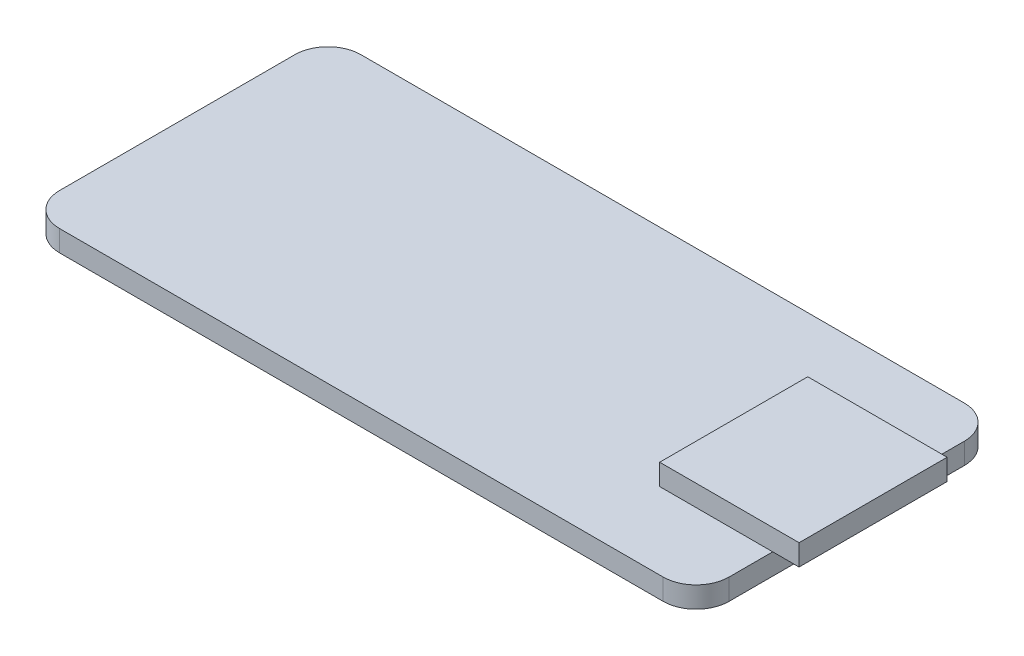
ISO-10303-21;
HEADER;
FILE_DESCRIPTION(('STEP AP214'),'2;1');
FILE_NAME('part.step','',(''),(''),'','','');
FILE_SCHEMA(('AUTOMOTIVE_DESIGN { 1 0 10303 214 1 1 1 1 }'));
ENDSEC;
DATA;
#1=APPLICATION_CONTEXT('core data for automotive mechanical design processes');
#2=APPLICATION_PROTOCOL_DEFINITION('international standard','automotive_design',2000,#1);
#3=PRODUCT_CONTEXT('',#1,'mechanical');
#4=PRODUCT('Part','Part','',(#3));
#5=PRODUCT_RELATED_PRODUCT_CATEGORY('part','',(#4));
#6=PRODUCT_DEFINITION_FORMATION('','',#4);
#7=PRODUCT_DEFINITION_CONTEXT('part definition',#1,'design');
#8=PRODUCT_DEFINITION('design','',#6,#7);
#9=PRODUCT_DEFINITION_SHAPE('','',#8);
#10=(LENGTH_UNIT() NAMED_UNIT(*) SI_UNIT(.MILLI.,.METRE.));
#11=(NAMED_UNIT(*) PLANE_ANGLE_UNIT() SI_UNIT($,.RADIAN.));
#12=(NAMED_UNIT(*) SI_UNIT($,.STERADIAN.) SOLID_ANGLE_UNIT());
#13=UNCERTAINTY_MEASURE_WITH_UNIT(LENGTH_MEASURE(1.E-05),#10,'distance_accuracy_value','');
#14=(GEOMETRIC_REPRESENTATION_CONTEXT(3) GLOBAL_UNCERTAINTY_ASSIGNED_CONTEXT((#13)) GLOBAL_UNIT_ASSIGNED_CONTEXT((#10,
#11,#12)) REPRESENTATION_CONTEXT('',''));
#15=CARTESIAN_POINT('',(0.,0.,0.));
#16=DIRECTION('',(0.,0.,1.));
#17=DIRECTION('',(1.,0.,0.));
#18=AXIS2_PLACEMENT_3D('',#15,#16,#17);
#19=CARTESIAN_POINT('',(22.9,1.6,-8.93));
#20=DIRECTION('',(0.,-1.,0.));
#21=DIRECTION('',(0.,0.,-1.));
#22=AXIS2_PLACEMENT_3D('',#19,#20,#21);
#23=PLANE('',#22);
#24=DIRECTION('',(-1.,0.,0.));
#25=VECTOR('',#24,1.);
#26=CARTESIAN_POINT('',(27.4,1.6,-5.61626047357319));
#27=LINE('',#26,#25);
#28=CARTESIAN_POINT('',(25.4,1.6,-5.61626047357319));
#29=VERTEX_POINT('',#28);
#30=CARTESIAN_POINT('',(16.8227094414371,1.6,-5.61626047357319));
#31=VERTEX_POINT('',#30);
#32=EDGE_CURVE('E11',#29,#31,#27,.T.);
#33=ORIENTED_EDGE('',*,*,#32,.F.);
#34=DIRECTION('',(0.,0.,-1.));
#35=VECTOR('',#34,1.);
#36=CARTESIAN_POINT('',(25.4,1.6,-8.92999999999998));
#37=LINE('',#36,#35);
#38=CARTESIAN_POINT('',(25.4,1.6,-8.92999999999998));
#39=VERTEX_POINT('',#38);
#40=EDGE_CURVE('E198',#29,#39,#37,.T.);
#41=ORIENTED_EDGE('',*,*,#40,.T.);
#42=CARTESIAN_POINT('',(22.9,1.6,-8.93));
#43=DIRECTION('',(0.,1.,0.));
#44=DIRECTION('',(0.,0.,-1.));
#45=AXIS2_PLACEMENT_3D('',#42,#43,#44);
#46=CIRCLE('',#45,2.5);
#47=CARTESIAN_POINT('',(22.9,1.6,-11.43));
#48=VERTEX_POINT('',#47);
#49=EDGE_CURVE('E175',#39,#48,#46,.T.);
#50=ORIENTED_EDGE('',*,*,#49,.T.);
#51=DIRECTION('',(-1.,0.,0.));
#52=VECTOR('',#51,1.);
#53=CARTESIAN_POINT('',(-22.9,1.6,-11.43));
#54=LINE('',#53,#52);
#55=CARTESIAN_POINT('',(-22.9,1.6,-11.43));
#56=VERTEX_POINT('',#55);
#57=EDGE_CURVE('E179',#48,#56,#54,.T.);
#58=ORIENTED_EDGE('',*,*,#57,.T.);
#59=CARTESIAN_POINT('',(-22.9,1.6,-8.93));
#60=DIRECTION('',(0.,1.,0.));
#61=DIRECTION('',(0.,0.,1.));
#62=AXIS2_PLACEMENT_3D('',#59,#60,#61);
#63=CIRCLE('',#62,2.5);
#64=CARTESIAN_POINT('',(-25.4,1.6,-8.92999999999998));
#65=VERTEX_POINT('',#64);
#66=EDGE_CURVE('E183',#56,#65,#63,.T.);
#67=ORIENTED_EDGE('',*,*,#66,.T.);
#68=DIRECTION('',(0.,0.,1.));
#69=VECTOR('',#68,1.);
#70=CARTESIAN_POINT('',(-25.4,1.6,-8.92999999999998));
#71=LINE('',#70,#69);
#72=CARTESIAN_POINT('',(-25.4,1.6,8.92999999999999));
#73=VERTEX_POINT('',#72);
#74=EDGE_CURVE('E186',#65,#73,#71,.T.);
#75=ORIENTED_EDGE('',*,*,#74,.T.);
#76=CARTESIAN_POINT('',(-22.9,1.6,8.93));
#77=DIRECTION('',(0.,1.,0.));
#78=DIRECTION('',(0.,0.,1.));
#79=AXIS2_PLACEMENT_3D('',#76,#77,#78);
#80=CIRCLE('',#79,2.5);
#81=CARTESIAN_POINT('',(-22.9,1.6,11.43));
#82=VERTEX_POINT('',#81);
#83=EDGE_CURVE('E189',#73,#82,#80,.T.);
#84=ORIENTED_EDGE('',*,*,#83,.T.);
#85=DIRECTION('',(1.,0.,0.));
#86=VECTOR('',#85,1.);
#87=CARTESIAN_POINT('',(-22.9,1.6,11.43));
#88=LINE('',#87,#86);
#89=CARTESIAN_POINT('',(22.9,1.6,11.43));
#90=VERTEX_POINT('',#89);
#91=EDGE_CURVE('E192',#82,#90,#88,.T.);
#92=ORIENTED_EDGE('',*,*,#91,.T.);
#93=CARTESIAN_POINT('',(22.9,1.6,8.93));
#94=DIRECTION('',(0.,1.,0.));
#95=DIRECTION('',(0.,0.,1.));
#96=AXIS2_PLACEMENT_3D('',#93,#94,#95);
#97=CIRCLE('',#96,2.5);
#98=CARTESIAN_POINT('',(25.4,1.6,8.92999999999999));
#99=VERTEX_POINT('',#98);
#100=EDGE_CURVE('E195',#90,#99,#97,.T.);
#101=ORIENTED_EDGE('',*,*,#100,.T.);
#102=CARTESIAN_POINT('',(25.4,1.6,5.6162604735732));
#103=VERTEX_POINT('',#102);
#104=EDGE_CURVE('E199',#99,#103,#37,.T.);
#105=ORIENTED_EDGE('',*,*,#104,.T.);
#106=DIRECTION('',(1.,0.,0.));
#107=VECTOR('',#106,1.);
#108=CARTESIAN_POINT('',(27.4,1.6,5.6162604735732));
#109=LINE('',#108,#107);
#110=CARTESIAN_POINT('',(16.8227094414371,1.6,5.61626047357321));
#111=VERTEX_POINT('',#110);
#112=EDGE_CURVE('E67',#111,#103,#109,.T.);
#113=ORIENTED_EDGE('',*,*,#112,.F.);
#114=DIRECTION('',(0.,0.,1.));
#115=VECTOR('',#114,1.);
#116=CARTESIAN_POINT('',(16.8227094414371,1.6,-5.61626047357319));
#117=LINE('',#116,#115);
#118=EDGE_CURVE('E63',#31,#111,#117,.T.);
#119=ORIENTED_EDGE('',*,*,#118,.F.);
#120=EDGE_LOOP('',(#33,#41,#50,#58,#67,#75,#84,#92,#101,#105,#113,#119));
#121=FACE_BOUND('',#120,.T.);
#122=ADVANCED_FACE('F45',(#121),#23,.F.);
#123=CARTESIAN_POINT('',(22.9,1.6,-8.93));
#124=DIRECTION('',(0.,-1.,0.));
#125=DIRECTION('',(0.,0.,-1.));
#126=AXIS2_PLACEMENT_3D('',#123,#124,#125);
#127=CYLINDRICAL_SURFACE('',#126,2.5);
#128=CARTESIAN_POINT('',(22.9,0.,-8.93));
#129=DIRECTION('',(0.,1.,0.));
#130=DIRECTION('',(0.,0.,-1.));
#131=AXIS2_PLACEMENT_3D('',#128,#129,#130);
#132=CIRCLE('',#131,2.5);
#133=CARTESIAN_POINT('',(25.4,0.,-8.92999999999998));
#134=VERTEX_POINT('',#133);
#135=CARTESIAN_POINT('',(22.9,0.,-11.43));
#136=VERTEX_POINT('',#135);
#137=EDGE_CURVE('E164',#134,#136,#132,.T.);
#138=ORIENTED_EDGE('',*,*,#137,.T.);
#139=DIRECTION('',(0.,-1.,0.));
#140=VECTOR('',#139,1.);
#141=CARTESIAN_POINT('',(22.9,1.6,-11.43));
#142=LINE('',#141,#140);
#143=EDGE_CURVE('E49',#48,#136,#142,.T.);
#144=ORIENTED_EDGE('',*,*,#143,.F.);
#145=ORIENTED_EDGE('',*,*,#49,.F.);
#146=DIRECTION('',(0.,-1.,0.));
#147=VECTOR('',#146,1.);
#148=CARTESIAN_POINT('',(25.4,1.6,-8.92999999999998));
#149=LINE('',#148,#147);
#150=EDGE_CURVE('E201',#39,#134,#149,.T.);
#151=ORIENTED_EDGE('',*,*,#150,.T.);
#152=EDGE_LOOP('',(#138,#144,#145,#151));
#153=FACE_BOUND('',#152,.T.);
#154=ADVANCED_FACE('F47',(#153),#127,.T.);
#155=CARTESIAN_POINT('',(-22.9,1.6,-11.43));
#156=DIRECTION('',(0.,0.,1.));
#157=DIRECTION('',(1.,0.,0.));
#158=AXIS2_PLACEMENT_3D('',#155,#156,#157);
#159=PLANE('',#158);
#160=DIRECTION('',(-1.,0.,0.));
#161=VECTOR('',#160,1.);
#162=CARTESIAN_POINT('',(-22.9,0.,-11.43));
#163=LINE('',#162,#161);
#164=CARTESIAN_POINT('',(-22.9,0.,-11.43));
#165=VERTEX_POINT('',#164);
#166=EDGE_CURVE('E169',#136,#165,#163,.T.);
#167=ORIENTED_EDGE('',*,*,#166,.T.);
#168=DIRECTION('',(0.,-1.,0.));
#169=VECTOR('',#168,1.);
#170=CARTESIAN_POINT('',(-22.9,1.6,-11.43));
#171=LINE('',#170,#169);
#172=EDGE_CURVE('E245',#56,#165,#171,.T.);
#173=ORIENTED_EDGE('',*,*,#172,.F.);
#174=ORIENTED_EDGE('',*,*,#57,.F.);
#175=ORIENTED_EDGE('',*,*,#143,.T.);
#176=EDGE_LOOP('',(#167,#173,#174,#175));
#177=FACE_BOUND('',#176,.T.);
#178=ADVANCED_FACE('F256',(#177),#159,.F.);
#179=CARTESIAN_POINT('',(-22.9,1.6,-8.93));
#180=DIRECTION('',(0.,-1.,0.));
#181=DIRECTION('',(0.,0.,-1.));
#182=AXIS2_PLACEMENT_3D('',#179,#180,#181);
#183=CYLINDRICAL_SURFACE('',#182,2.5);
#184=CARTESIAN_POINT('',(-22.9,0.,-8.93));
#185=DIRECTION('',(0.,1.,0.));
#186=DIRECTION('',(0.,0.,1.));
#187=AXIS2_PLACEMENT_3D('',#184,#185,#186);
#188=CIRCLE('',#187,2.5);
#189=CARTESIAN_POINT('',(-25.4,0.,-8.92999999999998));
#190=VERTEX_POINT('',#189);
#191=EDGE_CURVE('E206',#165,#190,#188,.T.);
#192=ORIENTED_EDGE('',*,*,#191,.T.);
#193=DIRECTION('',(0.,-1.,0.));
#194=VECTOR('',#193,1.);
#195=CARTESIAN_POINT('',(-25.4,1.6,-8.92999999999998));
#196=LINE('',#195,#194);
#197=EDGE_CURVE('E242',#65,#190,#196,.T.);
#198=ORIENTED_EDGE('',*,*,#197,.F.);
#199=ORIENTED_EDGE('',*,*,#66,.F.);
#200=ORIENTED_EDGE('',*,*,#172,.T.);
#201=EDGE_LOOP('',(#192,#198,#199,#200));
#202=FACE_BOUND('',#201,.T.);
#203=ADVANCED_FACE('F268',(#202),#183,.T.);
#204=CARTESIAN_POINT('',(-25.4,1.6,-8.92999999999998));
#205=DIRECTION('',(1.,0.,0.));
#206=DIRECTION('',(0.,0.,-1.));
#207=AXIS2_PLACEMENT_3D('',#204,#205,#206);
#208=PLANE('',#207);
#209=DIRECTION('',(0.,0.,1.));
#210=VECTOR('',#209,1.);
#211=CARTESIAN_POINT('',(-25.4,0.,-8.92999999999998));
#212=LINE('',#211,#210);
#213=CARTESIAN_POINT('',(-25.4,0.,8.92999999999999));
#214=VERTEX_POINT('',#213);
#215=EDGE_CURVE('E209',#190,#214,#212,.T.);
#216=ORIENTED_EDGE('',*,*,#215,.T.);
#217=DIRECTION('',(0.,-1.,0.));
#218=VECTOR('',#217,1.);
#219=CARTESIAN_POINT('',(-25.4,1.6,8.92999999999999));
#220=LINE('',#219,#218);
#221=EDGE_CURVE('E238',#73,#214,#220,.T.);
#222=ORIENTED_EDGE('',*,*,#221,.F.);
#223=ORIENTED_EDGE('',*,*,#74,.F.);
#224=ORIENTED_EDGE('',*,*,#197,.T.);
#225=EDGE_LOOP('',(#216,#222,#223,#224));
#226=FACE_BOUND('',#225,.T.);
#227=ADVANCED_FACE('F271',(#226),#208,.F.);
#228=CARTESIAN_POINT('',(-22.9,1.6,8.93));
#229=DIRECTION('',(0.,-1.,0.));
#230=DIRECTION('',(0.,0.,-1.));
#231=AXIS2_PLACEMENT_3D('',#228,#229,#230);
#232=CYLINDRICAL_SURFACE('',#231,2.5);
#233=CARTESIAN_POINT('',(-22.9,0.,8.93));
#234=DIRECTION('',(0.,1.,0.));
#235=DIRECTION('',(0.,0.,1.));
#236=AXIS2_PLACEMENT_3D('',#233,#234,#235);
#237=CIRCLE('',#236,2.5);
#238=CARTESIAN_POINT('',(-22.9,0.,11.43));
#239=VERTEX_POINT('',#238);
#240=EDGE_CURVE('E212',#214,#239,#237,.T.);
#241=ORIENTED_EDGE('',*,*,#240,.T.);
#242=DIRECTION('',(0.,-1.,0.));
#243=VECTOR('',#242,1.);
#244=CARTESIAN_POINT('',(-22.9,1.6,11.43));
#245=LINE('',#244,#243);
#246=EDGE_CURVE('E234',#82,#239,#245,.T.);
#247=ORIENTED_EDGE('',*,*,#246,.F.);
#248=ORIENTED_EDGE('',*,*,#83,.F.);
#249=ORIENTED_EDGE('',*,*,#221,.T.);
#250=EDGE_LOOP('',(#241,#247,#248,#249));
#251=FACE_BOUND('',#250,.T.);
#252=ADVANCED_FACE('F292',(#251),#232,.T.);
#253=CARTESIAN_POINT('',(-22.9,1.6,11.43));
#254=DIRECTION('',(0.,0.,-1.));
#255=DIRECTION('',(-1.,0.,0.));
#256=AXIS2_PLACEMENT_3D('',#253,#254,#255);
#257=PLANE('',#256);
#258=DIRECTION('',(1.,0.,0.));
#259=VECTOR('',#258,1.);
#260=CARTESIAN_POINT('',(-22.9,0.,11.43));
#261=LINE('',#260,#259);
#262=CARTESIAN_POINT('',(22.9,0.,11.43));
#263=VERTEX_POINT('',#262);
#264=EDGE_CURVE('E215',#239,#263,#261,.T.);
#265=ORIENTED_EDGE('',*,*,#264,.T.);
#266=DIRECTION('',(0.,-1.,0.));
#267=VECTOR('',#266,1.);
#268=CARTESIAN_POINT('',(22.9,1.6,11.43));
#269=LINE('',#268,#267);
#270=EDGE_CURVE('E230',#90,#263,#269,.T.);
#271=ORIENTED_EDGE('',*,*,#270,.F.);
#272=ORIENTED_EDGE('',*,*,#91,.F.);
#273=ORIENTED_EDGE('',*,*,#246,.T.);
#274=EDGE_LOOP('',(#265,#271,#272,#273));
#275=FACE_BOUND('',#274,.T.);
#276=ADVANCED_FACE('F289',(#275),#257,.F.);
#277=CARTESIAN_POINT('',(22.9,1.6,8.93));
#278=DIRECTION('',(0.,-1.,0.));
#279=DIRECTION('',(0.,0.,-1.));
#280=AXIS2_PLACEMENT_3D('',#277,#278,#279);
#281=CYLINDRICAL_SURFACE('',#280,2.5);
#282=CARTESIAN_POINT('',(22.9,0.,8.93));
#283=DIRECTION('',(0.,1.,0.));
#284=DIRECTION('',(0.,0.,1.));
#285=AXIS2_PLACEMENT_3D('',#282,#283,#284);
#286=CIRCLE('',#285,2.5);
#287=CARTESIAN_POINT('',(25.4,0.,8.92999999999999));
#288=VERTEX_POINT('',#287);
#289=EDGE_CURVE('E218',#263,#288,#286,.T.);
#290=ORIENTED_EDGE('',*,*,#289,.T.);
#291=DIRECTION('',(0.,-1.,0.));
#292=VECTOR('',#291,1.);
#293=CARTESIAN_POINT('',(25.4,1.6,8.92999999999999));
#294=LINE('',#293,#292);
#295=EDGE_CURVE('E226',#99,#288,#294,.T.);
#296=ORIENTED_EDGE('',*,*,#295,.F.);
#297=ORIENTED_EDGE('',*,*,#100,.F.);
#298=ORIENTED_EDGE('',*,*,#270,.T.);
#299=EDGE_LOOP('',(#290,#296,#297,#298));
#300=FACE_BOUND('',#299,.T.);
#301=ADVANCED_FACE('F285',(#300),#281,.T.);
#302=CARTESIAN_POINT('',(25.4,1.6,-8.92999999999998));
#303=DIRECTION('',(-1.,0.,0.));
#304=DIRECTION('',(0.,0.,1.));
#305=AXIS2_PLACEMENT_3D('',#302,#303,#304);
#306=PLANE('',#305);
#307=DIRECTION('',(0.,0.,-1.));
#308=VECTOR('',#307,1.);
#309=CARTESIAN_POINT('',(25.4,0.,-8.92999999999998));
#310=LINE('',#309,#308);
#311=EDGE_CURVE('E180',#288,#134,#310,.T.);
#312=ORIENTED_EDGE('',*,*,#311,.T.);
#313=ORIENTED_EDGE('',*,*,#150,.F.);
#314=ORIENTED_EDGE('',*,*,#40,.F.);
#315=EDGE_CURVE('E202',#103,#29,#37,.T.);
#316=ORIENTED_EDGE('',*,*,#315,.F.);
#317=ORIENTED_EDGE('',*,*,#104,.F.);
#318=ORIENTED_EDGE('',*,*,#295,.T.);
#319=EDGE_LOOP('',(#312,#313,#314,#316,#317,#318));
#320=FACE_BOUND('',#319,.T.);
#321=ADVANCED_FACE('F280',(#320),#306,.F.);
#322=CARTESIAN_POINT('',(22.9,0.,-8.93));
#323=DIRECTION('',(0.,-1.,0.));
#324=DIRECTION('',(0.,0.,-1.));
#325=AXIS2_PLACEMENT_3D('',#322,#323,#324);
#326=PLANE('',#325);
#327=ORIENTED_EDGE('',*,*,#137,.F.);
#328=ORIENTED_EDGE('',*,*,#311,.F.);
#329=ORIENTED_EDGE('',*,*,#289,.F.);
#330=ORIENTED_EDGE('',*,*,#264,.F.);
#331=ORIENTED_EDGE('',*,*,#240,.F.);
#332=ORIENTED_EDGE('',*,*,#215,.F.);
#333=ORIENTED_EDGE('',*,*,#191,.F.);
#334=ORIENTED_EDGE('',*,*,#166,.F.);
#335=EDGE_LOOP('',(#327,#328,#329,#330,#331,#332,#333,#334));
#336=FACE_BOUND('',#335,.T.);
#337=ADVANCED_FACE('F263',(#336),#326,.T.);
#338=CARTESIAN_POINT('',(16.8227094414371,3.2,-5.61626047357319));
#339=DIRECTION('',(1.,0.,0.));
#340=DIRECTION('',(0.,0.,-1.));
#341=AXIS2_PLACEMENT_3D('',#338,#339,#340);
#342=PLANE('',#341);
#343=ORIENTED_EDGE('',*,*,#118,.T.);
#344=DIRECTION('',(0.,-1.,0.));
#345=VECTOR('',#344,1.);
#346=CARTESIAN_POINT('',(16.8227094414371,3.2,5.61626047357321));
#347=LINE('',#346,#345);
#348=CARTESIAN_POINT('',(16.8227094414371,3.2,5.61626047357321));
#349=VERTEX_POINT('',#348);
#350=EDGE_CURVE('E144',#349,#111,#347,.T.);
#351=ORIENTED_EDGE('',*,*,#350,.F.);
#352=DIRECTION('',(0.,0.,1.));
#353=VECTOR('',#352,1.);
#354=CARTESIAN_POINT('',(16.8227094414371,3.2,-5.61626047357319));
#355=LINE('',#354,#353);
#356=CARTESIAN_POINT('',(16.8227094414371,3.2,-5.61626047357319));
#357=VERTEX_POINT('',#356);
#358=EDGE_CURVE('E151',#357,#349,#355,.T.);
#359=ORIENTED_EDGE('',*,*,#358,.F.);
#360=DIRECTION('',(0.,-1.,0.));
#361=VECTOR('',#360,1.);
#362=CARTESIAN_POINT('',(16.8227094414371,3.2,-5.61626047357319));
#363=LINE('',#362,#361);
#364=EDGE_CURVE('E402',#357,#31,#363,.T.);
#365=ORIENTED_EDGE('',*,*,#364,.T.);
#366=EDGE_LOOP('',(#343,#351,#359,#365));
#367=FACE_BOUND('',#366,.T.);
#368=ADVANCED_FACE('F162',(#367),#342,.F.);
#369=CARTESIAN_POINT('',(27.4,3.2,5.6162604735732));
#370=DIRECTION('',(0.,0.,-1.));
#371=DIRECTION('',(-1.,0.,0.));
#372=AXIS2_PLACEMENT_3D('',#369,#370,#371);
#373=PLANE('',#372);
#374=ORIENTED_EDGE('',*,*,#112,.T.);
#375=CARTESIAN_POINT('',(27.4,1.6,5.6162604735732));
#376=VERTEX_POINT('',#375);
#377=EDGE_CURVE('E389',#103,#376,#109,.T.);
#378=ORIENTED_EDGE('',*,*,#377,.T.);
#379=DIRECTION('',(0.,-1.,0.));
#380=VECTOR('',#379,1.);
#381=CARTESIAN_POINT('',(27.4,3.2,5.6162604735732));
#382=LINE('',#381,#380);
#383=CARTESIAN_POINT('',(27.4,3.2,5.6162604735732));
#384=VERTEX_POINT('',#383);
#385=EDGE_CURVE('E146',#384,#376,#382,.T.);
#386=ORIENTED_EDGE('',*,*,#385,.F.);
#387=DIRECTION('',(1.,0.,0.));
#388=VECTOR('',#387,1.);
#389=CARTESIAN_POINT('',(27.4,3.2,5.6162604735732));
#390=LINE('',#389,#388);
#391=EDGE_CURVE('E140',#349,#384,#390,.T.);
#392=ORIENTED_EDGE('',*,*,#391,.F.);
#393=ORIENTED_EDGE('',*,*,#350,.T.);
#394=EDGE_LOOP('',(#374,#378,#386,#392,#393));
#395=FACE_BOUND('',#394,.T.);
#396=ADVANCED_FACE('F142',(#395),#373,.F.);
#397=CARTESIAN_POINT('',(27.4,3.2,-5.61626047357319));
#398=DIRECTION('',(-1.,0.,0.));
#399=DIRECTION('',(0.,0.,1.));
#400=AXIS2_PLACEMENT_3D('',#397,#398,#399);
#401=PLANE('',#400);
#402=DIRECTION('',(0.,0.,-1.));
#403=VECTOR('',#402,1.);
#404=CARTESIAN_POINT('',(27.4,1.6,-5.61626047357319));
#405=LINE('',#404,#403);
#406=CARTESIAN_POINT('',(27.4,1.6,-5.61626047357319));
#407=VERTEX_POINT('',#406);
#408=EDGE_CURVE('E392',#376,#407,#405,.T.);
#409=ORIENTED_EDGE('',*,*,#408,.T.);
#410=DIRECTION('',(0.,-1.,0.));
#411=VECTOR('',#410,1.);
#412=CARTESIAN_POINT('',(27.4,3.2,-5.61626047357319));
#413=LINE('',#412,#411);
#414=CARTESIAN_POINT('',(27.4,3.2,-5.61626047357319));
#415=VERTEX_POINT('',#414);
#416=EDGE_CURVE('E171',#415,#407,#413,.T.);
#417=ORIENTED_EDGE('',*,*,#416,.F.);
#418=DIRECTION('',(0.,0.,-1.));
#419=VECTOR('',#418,1.);
#420=CARTESIAN_POINT('',(27.4,3.2,-5.61626047357319));
#421=LINE('',#420,#419);
#422=EDGE_CURVE('E150',#384,#415,#421,.T.);
#423=ORIENTED_EDGE('',*,*,#422,.F.);
#424=ORIENTED_EDGE('',*,*,#385,.T.);
#425=EDGE_LOOP('',(#409,#417,#423,#424));
#426=FACE_BOUND('',#425,.T.);
#427=ADVANCED_FACE('F348',(#426),#401,.F.);
#428=CARTESIAN_POINT('',(27.4,3.2,-5.61626047357319));
#429=DIRECTION('',(0.,0.,1.));
#430=DIRECTION('',(1.,0.,0.));
#431=AXIS2_PLACEMENT_3D('',#428,#429,#430);
#432=PLANE('',#431);
#433=EDGE_CURVE('E56',#407,#29,#27,.T.);
#434=ORIENTED_EDGE('',*,*,#433,.T.);
#435=ORIENTED_EDGE('',*,*,#32,.T.);
#436=ORIENTED_EDGE('',*,*,#364,.F.);
#437=DIRECTION('',(-1.,0.,0.));
#438=VECTOR('',#437,1.);
#439=CARTESIAN_POINT('',(27.4,3.2,-5.61626047357319));
#440=LINE('',#439,#438);
#441=EDGE_CURVE('E156',#415,#357,#440,.T.);
#442=ORIENTED_EDGE('',*,*,#441,.F.);
#443=ORIENTED_EDGE('',*,*,#416,.T.);
#444=EDGE_LOOP('',(#434,#435,#436,#442,#443));
#445=FACE_BOUND('',#444,.T.);
#446=ADVANCED_FACE('F356',(#445),#432,.F.);
#447=CARTESIAN_POINT('',(0.,3.2,0.));
#448=DIRECTION('',(0.,-1.,0.));
#449=DIRECTION('',(0.,0.,-1.));
#450=AXIS2_PLACEMENT_3D('',#447,#448,#449);
#451=PLANE('',#450);
#452=ORIENTED_EDGE('',*,*,#358,.T.);
#453=ORIENTED_EDGE('',*,*,#391,.T.);
#454=ORIENTED_EDGE('',*,*,#422,.T.);
#455=ORIENTED_EDGE('',*,*,#441,.T.);
#456=EDGE_LOOP('',(#452,#453,#454,#455));
#457=FACE_BOUND('',#456,.T.);
#458=ADVANCED_FACE('F154',(#457),#451,.F.);
#459=CARTESIAN_POINT('',(0.,1.6,0.));
#460=DIRECTION('',(0.,-1.,0.));
#461=DIRECTION('',(0.,0.,-1.));
#462=AXIS2_PLACEMENT_3D('',#459,#460,#461);
#463=PLANE('',#462);
#464=ORIENTED_EDGE('',*,*,#377,.F.);
#465=ORIENTED_EDGE('',*,*,#315,.T.);
#466=ORIENTED_EDGE('',*,*,#433,.F.);
#467=ORIENTED_EDGE('',*,*,#408,.F.);
#468=EDGE_LOOP('',(#464,#465,#466,#467));
#469=FACE_BOUND('',#468,.T.);
#470=ADVANCED_FACE('F375',(#469),#463,.T.);
#471=CLOSED_SHELL('',(#122,#154,#178,#203,#227,#252,#276,#301,#321,#337,#368,#396,#427,#446,
#458,#470));
#472=MANIFOLD_SOLID_BREP('B2',#471);
#473=ADVANCED_BREP_SHAPE_REPRESENTATION('',(#18,#472),#14);
#474=SHAPE_DEFINITION_REPRESENTATION(#9,#473);
ENDSEC;
END-ISO-10303-21;
